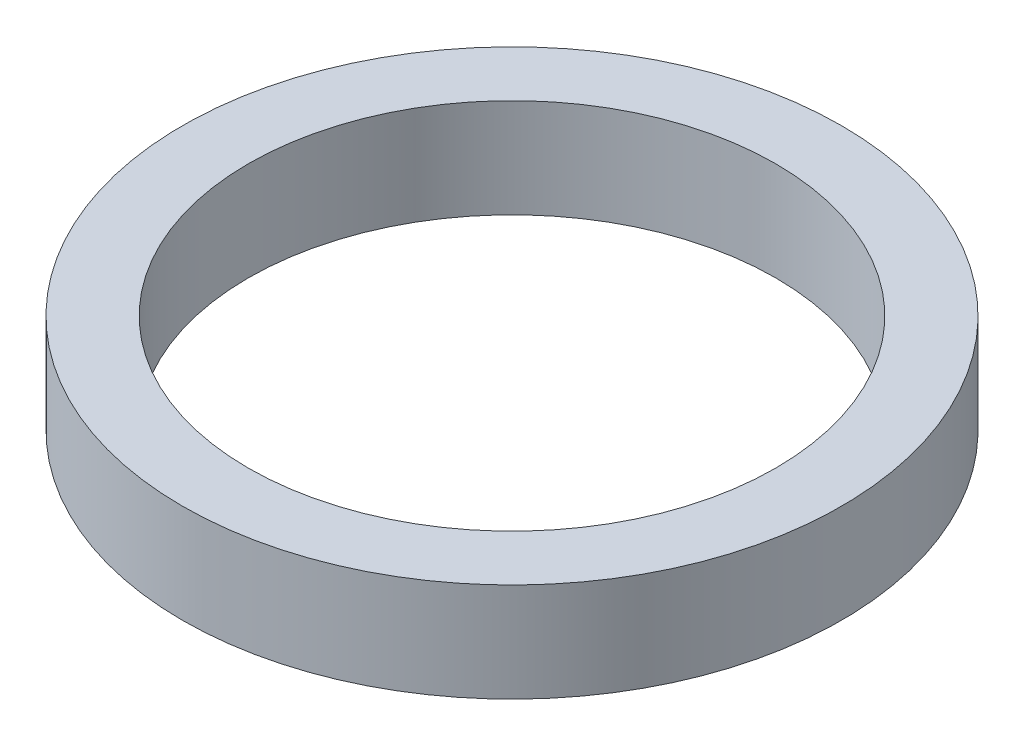
ISO-10303-21;
HEADER;
FILE_DESCRIPTION(('STEP AP214'),'2;1');
FILE_NAME('part.step','',(''),(''),'','','');
FILE_SCHEMA(('AUTOMOTIVE_DESIGN { 1 0 10303 214 1 1 1 1 }'));
ENDSEC;
DATA;
#1=APPLICATION_CONTEXT('core data for automotive mechanical design processes');
#2=APPLICATION_PROTOCOL_DEFINITION('international standard','automotive_design',2000,#1);
#3=PRODUCT_CONTEXT('',#1,'mechanical');
#4=PRODUCT('Part','Part','',(#3));
#5=PRODUCT_RELATED_PRODUCT_CATEGORY('part','',(#4));
#6=PRODUCT_DEFINITION_FORMATION('','',#4);
#7=PRODUCT_DEFINITION_CONTEXT('part definition',#1,'design');
#8=PRODUCT_DEFINITION('design','',#6,#7);
#9=PRODUCT_DEFINITION_SHAPE('','',#8);
#10=(LENGTH_UNIT() NAMED_UNIT(*) SI_UNIT(.MILLI.,.METRE.));
#11=(NAMED_UNIT(*) PLANE_ANGLE_UNIT() SI_UNIT($,.RADIAN.));
#12=(NAMED_UNIT(*) SI_UNIT($,.STERADIAN.) SOLID_ANGLE_UNIT());
#13=UNCERTAINTY_MEASURE_WITH_UNIT(LENGTH_MEASURE(1.E-05),#10,'distance_accuracy_value','');
#14=(GEOMETRIC_REPRESENTATION_CONTEXT(3) GLOBAL_UNCERTAINTY_ASSIGNED_CONTEXT((#13)) GLOBAL_UNIT_ASSIGNED_CONTEXT((#10,
#11,#12)) REPRESENTATION_CONTEXT('',''));
#15=CARTESIAN_POINT('',(0.,0.,0.));
#16=DIRECTION('',(0.,0.,1.));
#17=DIRECTION('',(1.,0.,0.));
#18=AXIS2_PLACEMENT_3D('',#15,#16,#17);
#19=CARTESIAN_POINT('',(0.,1.5,0.));
#20=DIRECTION('',(0.,1.,0.));
#21=DIRECTION('',(0.,0.,1.));
#22=AXIS2_PLACEMENT_3D('',#19,#20,#21);
#23=PLANE('',#22);
#24=CARTESIAN_POINT('',(0.,1.5,0.));
#25=DIRECTION('',(0.,1.,0.));
#26=DIRECTION('',(0.,0.,1.));
#27=AXIS2_PLACEMENT_3D('',#24,#25,#26);
#28=CIRCLE('',#27,5.);
#29=CARTESIAN_POINT('',(0.,1.5,5.));
#30=VERTEX_POINT('',#29);
#31=EDGE_CURVE('E10',#30,#30,#28,.T.);
#32=ORIENTED_EDGE('',*,*,#31,.T.);
#33=EDGE_LOOP('',(#32));
#34=FACE_BOUND('',#33,.T.);
#35=CARTESIAN_POINT('',(0.,1.5,0.));
#36=DIRECTION('',(0.,1.,0.));
#37=DIRECTION('',(0.,0.,1.));
#38=AXIS2_PLACEMENT_3D('',#35,#36,#37);
#39=CIRCLE('',#38,4.);
#40=CARTESIAN_POINT('',(0.,1.5,4.));
#41=VERTEX_POINT('',#40);
#42=EDGE_CURVE('E48',#41,#41,#39,.T.);
#43=ORIENTED_EDGE('',*,*,#42,.F.);
#44=EDGE_LOOP('',(#43));
#45=FACE_BOUND('',#44,.T.);
#46=ADVANCED_FACE('F40',(#34,#45),#23,.T.);
#47=CARTESIAN_POINT('',(0.,0.,0.));
#48=DIRECTION('',(0.,1.,0.));
#49=DIRECTION('',(0.,0.,1.));
#50=AXIS2_PLACEMENT_3D('',#47,#48,#49);
#51=PLANE('',#50);
#52=CARTESIAN_POINT('',(0.,0.,0.));
#53=DIRECTION('',(0.,1.,0.));
#54=DIRECTION('',(0.,0.,1.));
#55=AXIS2_PLACEMENT_3D('',#52,#53,#54);
#56=CIRCLE('',#55,5.);
#57=CARTESIAN_POINT('',(0.,0.,5.));
#58=VERTEX_POINT('',#57);
#59=EDGE_CURVE('E41',#58,#58,#56,.T.);
#60=ORIENTED_EDGE('',*,*,#59,.F.);
#61=EDGE_LOOP('',(#60));
#62=FACE_BOUND('',#61,.T.);
#63=CARTESIAN_POINT('',(0.,0.,0.));
#64=DIRECTION('',(0.,1.,0.));
#65=DIRECTION('',(0.,0.,1.));
#66=AXIS2_PLACEMENT_3D('',#63,#64,#65);
#67=CIRCLE('',#66,4.);
#68=CARTESIAN_POINT('',(0.,0.,4.));
#69=VERTEX_POINT('',#68);
#70=EDGE_CURVE('E49',#69,#69,#67,.T.);
#71=ORIENTED_EDGE('',*,*,#70,.T.);
#72=EDGE_LOOP('',(#71));
#73=FACE_BOUND('',#72,.T.);
#74=ADVANCED_FACE('F58',(#62,#73),#51,.F.);
#75=CARTESIAN_POINT('',(0.,1.5,0.));
#76=DIRECTION('',(0.,-1.,0.));
#77=DIRECTION('',(0.,0.,-1.));
#78=AXIS2_PLACEMENT_3D('',#75,#76,#77);
#79=CYLINDRICAL_SURFACE('',#78,5.);
#80=ORIENTED_EDGE('',*,*,#31,.F.);
#81=EDGE_LOOP('',(#80));
#82=FACE_BOUND('',#81,.T.);
#83=ORIENTED_EDGE('',*,*,#59,.T.);
#84=EDGE_LOOP('',(#83));
#85=FACE_BOUND('',#84,.T.);
#86=ADVANCED_FACE('F39',(#82,#85),#79,.T.);
#87=CARTESIAN_POINT('',(0.,1.5,0.));
#88=DIRECTION('',(0.,-1.,0.));
#89=DIRECTION('',(0.,0.,-1.));
#90=AXIS2_PLACEMENT_3D('',#87,#88,#89);
#91=CYLINDRICAL_SURFACE('',#90,4.);
#92=ORIENTED_EDGE('',*,*,#42,.T.);
#93=EDGE_LOOP('',(#92));
#94=FACE_BOUND('',#93,.T.);
#95=ORIENTED_EDGE('',*,*,#70,.F.);
#96=EDGE_LOOP('',(#95));
#97=FACE_BOUND('',#96,.T.);
#98=ADVANCED_FACE('F57',(#94,#97),#91,.F.);
#99=CLOSED_SHELL('',(#46,#74,#86,#98));
#100=MANIFOLD_SOLID_BREP('B2',#99);
#101=ADVANCED_BREP_SHAPE_REPRESENTATION('',(#18,#100),#14);
#102=SHAPE_DEFINITION_REPRESENTATION(#9,#101);
ENDSEC;
END-ISO-10303-21;
